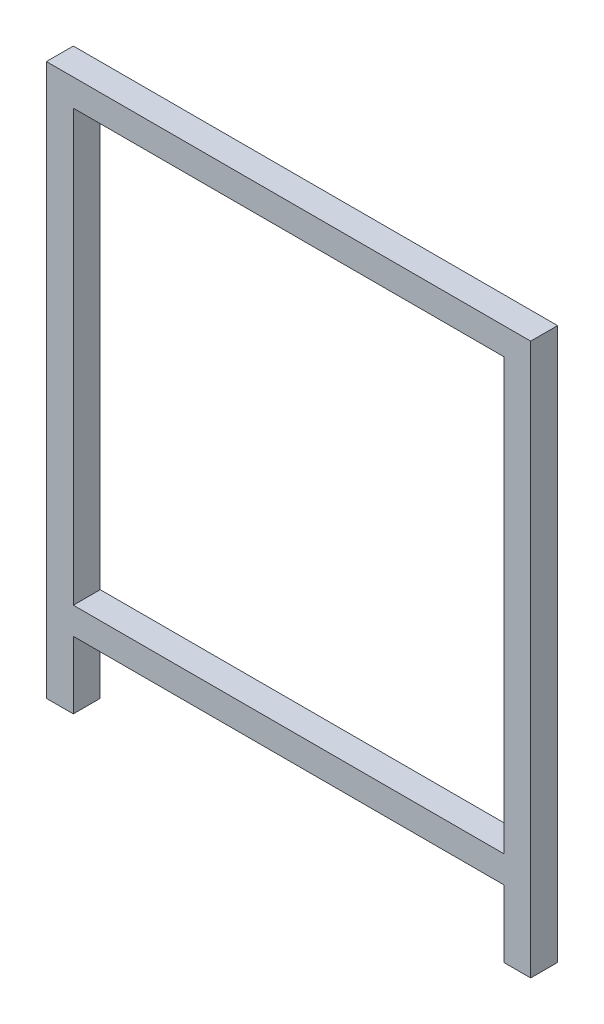
ISO-10303-21;
HEADER;
FILE_DESCRIPTION(('STEP AP214'),'2;1');
FILE_NAME('part.step','',(''),(''),'','','');
FILE_SCHEMA(('AUTOMOTIVE_DESIGN { 1 0 10303 214 1 1 1 1 }'));
ENDSEC;
DATA;
#1=APPLICATION_CONTEXT('core data for automotive mechanical design processes');
#2=APPLICATION_PROTOCOL_DEFINITION('international standard','automotive_design',2000,#1);
#3=PRODUCT_CONTEXT('',#1,'mechanical');
#4=PRODUCT('Part','Part','',(#3));
#5=PRODUCT_RELATED_PRODUCT_CATEGORY('part','',(#4));
#6=PRODUCT_DEFINITION_FORMATION('','',#4);
#7=PRODUCT_DEFINITION_CONTEXT('part definition',#1,'design');
#8=PRODUCT_DEFINITION('design','',#6,#7);
#9=PRODUCT_DEFINITION_SHAPE('','',#8);
#10=(LENGTH_UNIT() NAMED_UNIT(*) SI_UNIT(.MILLI.,.METRE.));
#11=(NAMED_UNIT(*) PLANE_ANGLE_UNIT() SI_UNIT($,.RADIAN.));
#12=(NAMED_UNIT(*) SI_UNIT($,.STERADIAN.) SOLID_ANGLE_UNIT());
#13=UNCERTAINTY_MEASURE_WITH_UNIT(LENGTH_MEASURE(1.E-05),#10,'distance_accuracy_value','');
#14=(GEOMETRIC_REPRESENTATION_CONTEXT(3) GLOBAL_UNCERTAINTY_ASSIGNED_CONTEXT((#13)) GLOBAL_UNIT_ASSIGNED_CONTEXT((#10,
#11,#12)) REPRESENTATION_CONTEXT('',''));
#15=CARTESIAN_POINT('',(0.,0.,0.));
#16=DIRECTION('',(0.,0.,1.));
#17=DIRECTION('',(1.,0.,0.));
#18=AXIS2_PLACEMENT_3D('',#15,#16,#17);
#19=CARTESIAN_POINT('',(-180.,180.,-10.));
#20=DIRECTION('',(-1.,0.,0.));
#21=DIRECTION('',(0.,-1.,0.));
#22=AXIS2_PLACEMENT_3D('',#19,#20,#21);
#23=PLANE('',#22);
#24=DIRECTION('',(0.,-1.,0.));
#25=VECTOR('',#24,1.);
#26=CARTESIAN_POINT('',(-180.,180.,10.));
#27=LINE('',#26,#25);
#28=CARTESIAN_POINT('',(-180.,180.,10.));
#29=VERTEX_POINT('',#28);
#30=CARTESIAN_POINT('',(-180.,-230.,10.));
#31=VERTEX_POINT('',#30);
#32=EDGE_CURVE('E154',#29,#31,#27,.T.);
#33=ORIENTED_EDGE('',*,*,#32,.F.);
#34=DIRECTION('',(0.,0.,1.));
#35=VECTOR('',#34,1.);
#36=CARTESIAN_POINT('',(-180.,180.,-10.));
#37=LINE('',#36,#35);
#38=CARTESIAN_POINT('',(-180.,180.,-10.));
#39=VERTEX_POINT('',#38);
#40=EDGE_CURVE('E11',#39,#29,#37,.T.);
#41=ORIENTED_EDGE('',*,*,#40,.F.);
#42=DIRECTION('',(0.,-1.,0.));
#43=VECTOR('',#42,1.);
#44=CARTESIAN_POINT('',(-180.,180.,-10.));
#45=LINE('',#44,#43);
#46=CARTESIAN_POINT('',(-180.,-230.,-10.));
#47=VERTEX_POINT('',#46);
#48=EDGE_CURVE('E158',#39,#47,#45,.T.);
#49=ORIENTED_EDGE('',*,*,#48,.T.);
#50=DIRECTION('',(0.,0.,1.));
#51=VECTOR('',#50,1.);
#52=CARTESIAN_POINT('',(-180.,-230.,-10.));
#53=LINE('',#52,#51);
#54=EDGE_CURVE('E35',#47,#31,#53,.T.);
#55=ORIENTED_EDGE('',*,*,#54,.T.);
#56=EDGE_LOOP('',(#33,#41,#49,#55));
#57=FACE_BOUND('',#56,.T.);
#58=ADVANCED_FACE('F32',(#57),#23,.T.);
#59=CARTESIAN_POINT('',(-180.,180.,-10.));
#60=DIRECTION('',(0.,1.,0.));
#61=DIRECTION('',(0.,0.,1.));
#62=AXIS2_PLACEMENT_3D('',#59,#60,#61);
#63=PLANE('',#62);
#64=DIRECTION('',(-1.,0.,0.));
#65=VECTOR('',#64,1.);
#66=CARTESIAN_POINT('',(-180.,180.,10.));
#67=LINE('',#66,#65);
#68=CARTESIAN_POINT('',(180.,180.,10.));
#69=VERTEX_POINT('',#68);
#70=EDGE_CURVE('E162',#69,#29,#67,.T.);
#71=ORIENTED_EDGE('',*,*,#70,.F.);
#72=DIRECTION('',(0.,0.,1.));
#73=VECTOR('',#72,1.);
#74=CARTESIAN_POINT('',(180.,180.,-10.));
#75=LINE('',#74,#73);
#76=CARTESIAN_POINT('',(180.,180.,-10.));
#77=VERTEX_POINT('',#76);
#78=EDGE_CURVE('E40',#77,#69,#75,.T.);
#79=ORIENTED_EDGE('',*,*,#78,.F.);
#80=DIRECTION('',(-1.,0.,0.));
#81=VECTOR('',#80,1.);
#82=CARTESIAN_POINT('',(-180.,180.,-10.));
#83=LINE('',#82,#81);
#84=EDGE_CURVE('E180',#77,#39,#83,.T.);
#85=ORIENTED_EDGE('',*,*,#84,.T.);
#86=ORIENTED_EDGE('',*,*,#40,.T.);
#87=EDGE_LOOP('',(#71,#79,#85,#86));
#88=FACE_BOUND('',#87,.T.);
#89=ADVANCED_FACE('F227',(#88),#63,.T.);
#90=CARTESIAN_POINT('',(180.,180.,-10.));
#91=DIRECTION('',(1.,0.,0.));
#92=DIRECTION('',(0.,1.,0.));
#93=AXIS2_PLACEMENT_3D('',#90,#91,#92);
#94=PLANE('',#93);
#95=DIRECTION('',(0.,1.,0.));
#96=VECTOR('',#95,1.);
#97=CARTESIAN_POINT('',(180.,180.,10.));
#98=LINE('',#97,#96);
#99=CARTESIAN_POINT('',(180.,-230.,10.));
#100=VERTEX_POINT('',#99);
#101=EDGE_CURVE('E200',#100,#69,#98,.T.);
#102=ORIENTED_EDGE('',*,*,#101,.F.);
#103=DIRECTION('',(0.,0.,1.));
#104=VECTOR('',#103,1.);
#105=CARTESIAN_POINT('',(180.,-230.,-10.));
#106=LINE('',#105,#104);
#107=CARTESIAN_POINT('',(180.,-230.,-10.));
#108=VERTEX_POINT('',#107);
#109=EDGE_CURVE('E206',#108,#100,#106,.T.);
#110=ORIENTED_EDGE('',*,*,#109,.F.);
#111=DIRECTION('',(0.,1.,0.));
#112=VECTOR('',#111,1.);
#113=CARTESIAN_POINT('',(180.,180.,-10.));
#114=LINE('',#113,#112);
#115=EDGE_CURVE('E177',#108,#77,#114,.T.);
#116=ORIENTED_EDGE('',*,*,#115,.T.);
#117=ORIENTED_EDGE('',*,*,#78,.T.);
#118=EDGE_LOOP('',(#102,#110,#116,#117));
#119=FACE_BOUND('',#118,.T.);
#120=ADVANCED_FACE('F246',(#119),#94,.T.);
#121=CARTESIAN_POINT('',(160.,-230.,-10.));
#122=DIRECTION('',(0.,-1.,0.));
#123=DIRECTION('',(1.,0.,0.));
#124=AXIS2_PLACEMENT_3D('',#121,#122,#123);
#125=PLANE('',#124);
#126=DIRECTION('',(1.,0.,0.));
#127=VECTOR('',#126,1.);
#128=CARTESIAN_POINT('',(160.,-230.,10.));
#129=LINE('',#128,#127);
#130=CARTESIAN_POINT('',(160.,-230.,10.));
#131=VERTEX_POINT('',#130);
#132=EDGE_CURVE('E197',#131,#100,#129,.T.);
#133=ORIENTED_EDGE('',*,*,#132,.F.);
#134=DIRECTION('',(0.,0.,1.));
#135=VECTOR('',#134,1.);
#136=CARTESIAN_POINT('',(160.,-230.,-10.));
#137=LINE('',#136,#135);
#138=CARTESIAN_POINT('',(160.,-230.,-10.));
#139=VERTEX_POINT('',#138);
#140=EDGE_CURVE('E208',#139,#131,#137,.T.);
#141=ORIENTED_EDGE('',*,*,#140,.F.);
#142=DIRECTION('',(1.,0.,0.));
#143=VECTOR('',#142,1.);
#144=CARTESIAN_POINT('',(160.,-230.,-10.));
#145=LINE('',#144,#143);
#146=EDGE_CURVE('E174',#139,#108,#145,.T.);
#147=ORIENTED_EDGE('',*,*,#146,.T.);
#148=ORIENTED_EDGE('',*,*,#109,.T.);
#149=EDGE_LOOP('',(#133,#141,#147,#148));
#150=FACE_BOUND('',#149,.T.);
#151=ADVANCED_FACE('F244',(#150),#125,.T.);
#152=CARTESIAN_POINT('',(160.,-230.,-10.));
#153=DIRECTION('',(-1.,0.,0.));
#154=DIRECTION('',(0.,0.,1.));
#155=AXIS2_PLACEMENT_3D('',#152,#153,#154);
#156=PLANE('',#155);
#157=DIRECTION('',(0.,-1.,0.));
#158=VECTOR('',#157,1.);
#159=CARTESIAN_POINT('',(160.,-230.,10.));
#160=LINE('',#159,#158);
#161=CARTESIAN_POINT('',(160.,-180.,10.));
#162=VERTEX_POINT('',#161);
#163=EDGE_CURVE('E194',#162,#131,#160,.T.);
#164=ORIENTED_EDGE('',*,*,#163,.F.);
#165=DIRECTION('',(0.,0.,1.));
#166=VECTOR('',#165,1.);
#167=CARTESIAN_POINT('',(160.,-180.,-10.));
#168=LINE('',#167,#166);
#169=CARTESIAN_POINT('',(160.,-180.,-10.));
#170=VERTEX_POINT('',#169);
#171=EDGE_CURVE('E210',#170,#162,#168,.T.);
#172=ORIENTED_EDGE('',*,*,#171,.F.);
#173=DIRECTION('',(0.,-1.,0.));
#174=VECTOR('',#173,1.);
#175=CARTESIAN_POINT('',(160.,-230.,-10.));
#176=LINE('',#175,#174);
#177=EDGE_CURVE('E171',#170,#139,#176,.T.);
#178=ORIENTED_EDGE('',*,*,#177,.T.);
#179=ORIENTED_EDGE('',*,*,#140,.T.);
#180=EDGE_LOOP('',(#164,#172,#178,#179));
#181=FACE_BOUND('',#180,.T.);
#182=ADVANCED_FACE('F240',(#181),#156,.T.);
#183=CARTESIAN_POINT('',(160.,-180.,-10.));
#184=DIRECTION('',(0.,-1.,0.));
#185=DIRECTION('',(1.,0.,0.));
#186=AXIS2_PLACEMENT_3D('',#183,#184,#185);
#187=PLANE('',#186);
#188=DIRECTION('',(1.,0.,0.));
#189=VECTOR('',#188,1.);
#190=CARTESIAN_POINT('',(160.,-180.,10.));
#191=LINE('',#190,#189);
#192=CARTESIAN_POINT('',(-160.,-180.,10.));
#193=VERTEX_POINT('',#192);
#194=EDGE_CURVE('E191',#193,#162,#191,.T.);
#195=ORIENTED_EDGE('',*,*,#194,.F.);
#196=DIRECTION('',(0.,0.,1.));
#197=VECTOR('',#196,1.);
#198=CARTESIAN_POINT('',(-160.,-180.,-10.));
#199=LINE('',#198,#197);
#200=CARTESIAN_POINT('',(-160.,-180.,-10.));
#201=VERTEX_POINT('',#200);
#202=EDGE_CURVE('E212',#201,#193,#199,.T.);
#203=ORIENTED_EDGE('',*,*,#202,.F.);
#204=DIRECTION('',(1.,0.,0.));
#205=VECTOR('',#204,1.);
#206=CARTESIAN_POINT('',(160.,-180.,-10.));
#207=LINE('',#206,#205);
#208=EDGE_CURVE('E168',#201,#170,#207,.T.);
#209=ORIENTED_EDGE('',*,*,#208,.T.);
#210=ORIENTED_EDGE('',*,*,#171,.T.);
#211=EDGE_LOOP('',(#195,#203,#209,#210));
#212=FACE_BOUND('',#211,.T.);
#213=ADVANCED_FACE('F238',(#212),#187,.T.);
#214=CARTESIAN_POINT('',(-160.,-180.,-10.));
#215=DIRECTION('',(1.,0.,0.));
#216=DIRECTION('',(0.,0.,-1.));
#217=AXIS2_PLACEMENT_3D('',#214,#215,#216);
#218=PLANE('',#217);
#219=DIRECTION('',(0.,1.,0.));
#220=VECTOR('',#219,1.);
#221=CARTESIAN_POINT('',(-160.,-180.,10.));
#222=LINE('',#221,#220);
#223=CARTESIAN_POINT('',(-160.,-230.,10.));
#224=VERTEX_POINT('',#223);
#225=EDGE_CURVE('E188',#224,#193,#222,.T.);
#226=ORIENTED_EDGE('',*,*,#225,.F.);
#227=DIRECTION('',(0.,0.,1.));
#228=VECTOR('',#227,1.);
#229=CARTESIAN_POINT('',(-160.,-230.,-10.));
#230=LINE('',#229,#228);
#231=CARTESIAN_POINT('',(-160.,-230.,-10.));
#232=VERTEX_POINT('',#231);
#233=EDGE_CURVE('E213',#232,#224,#230,.T.);
#234=ORIENTED_EDGE('',*,*,#233,.F.);
#235=DIRECTION('',(0.,1.,0.));
#236=VECTOR('',#235,1.);
#237=CARTESIAN_POINT('',(-160.,-180.,-10.));
#238=LINE('',#237,#236);
#239=EDGE_CURVE('E165',#232,#201,#238,.T.);
#240=ORIENTED_EDGE('',*,*,#239,.T.);
#241=ORIENTED_EDGE('',*,*,#202,.T.);
#242=EDGE_LOOP('',(#226,#234,#240,#241));
#243=FACE_BOUND('',#242,.T.);
#244=ADVANCED_FACE('F234',(#243),#218,.T.);
#245=CARTESIAN_POINT('',(-180.,-230.,-10.));
#246=DIRECTION('',(0.,-1.,0.));
#247=DIRECTION('',(0.,0.,-1.));
#248=AXIS2_PLACEMENT_3D('',#245,#246,#247);
#249=PLANE('',#248);
#250=DIRECTION('',(1.,0.,0.));
#251=VECTOR('',#250,1.);
#252=CARTESIAN_POINT('',(-180.,-230.,10.));
#253=LINE('',#252,#251);
#254=EDGE_CURVE('E185',#31,#224,#253,.T.);
#255=ORIENTED_EDGE('',*,*,#254,.F.);
#256=ORIENTED_EDGE('',*,*,#54,.F.);
#257=DIRECTION('',(1.,0.,0.));
#258=VECTOR('',#257,1.);
#259=CARTESIAN_POINT('',(-180.,-230.,-10.));
#260=LINE('',#259,#258);
#261=EDGE_CURVE('E161',#47,#232,#260,.T.);
#262=ORIENTED_EDGE('',*,*,#261,.T.);
#263=ORIENTED_EDGE('',*,*,#233,.T.);
#264=EDGE_LOOP('',(#255,#256,#262,#263));
#265=FACE_BOUND('',#264,.T.);
#266=ADVANCED_FACE('F221',(#265),#249,.T.);
#267=CARTESIAN_POINT('',(0.,0.,-10.));
#268=DIRECTION('',(0.,0.,1.));
#269=DIRECTION('',(1.,0.,0.));
#270=AXIS2_PLACEMENT_3D('',#267,#268,#269);
#271=PLANE('',#270);
#272=DIRECTION('',(-1.,0.,0.));
#273=VECTOR('',#272,1.);
#274=CARTESIAN_POINT('',(-160.,160.,-10.));
#275=LINE('',#274,#273);
#276=CARTESIAN_POINT('',(160.,160.,-10.));
#277=VERTEX_POINT('',#276);
#278=CARTESIAN_POINT('',(-160.,160.,-10.));
#279=VERTEX_POINT('',#278);
#280=EDGE_CURVE('E129',#277,#279,#275,.T.);
#281=ORIENTED_EDGE('',*,*,#280,.T.);
#282=DIRECTION('',(0.,-1.,0.));
#283=VECTOR('',#282,1.);
#284=CARTESIAN_POINT('',(-160.,160.,-10.));
#285=LINE('',#284,#283);
#286=CARTESIAN_POINT('',(-160.,-160.,-10.));
#287=VERTEX_POINT('',#286);
#288=EDGE_CURVE('E123',#279,#287,#285,.T.);
#289=ORIENTED_EDGE('',*,*,#288,.T.);
#290=DIRECTION('',(1.,0.,0.));
#291=VECTOR('',#290,1.);
#292=CARTESIAN_POINT('',(-160.,-160.,-10.));
#293=LINE('',#292,#291);
#294=CARTESIAN_POINT('',(160.,-160.,-10.));
#295=VERTEX_POINT('',#294);
#296=EDGE_CURVE('E132',#287,#295,#293,.T.);
#297=ORIENTED_EDGE('',*,*,#296,.T.);
#298=DIRECTION('',(0.,1.,0.));
#299=VECTOR('',#298,1.);
#300=CARTESIAN_POINT('',(160.,160.,-10.));
#301=LINE('',#300,#299);
#302=EDGE_CURVE('E48',#295,#277,#301,.T.);
#303=ORIENTED_EDGE('',*,*,#302,.T.);
#304=EDGE_LOOP('',(#281,#289,#297,#303));
#305=FACE_BOUND('',#304,.T.);
#306=ORIENTED_EDGE('',*,*,#48,.F.);
#307=ORIENTED_EDGE('',*,*,#84,.F.);
#308=ORIENTED_EDGE('',*,*,#115,.F.);
#309=ORIENTED_EDGE('',*,*,#146,.F.);
#310=ORIENTED_EDGE('',*,*,#177,.F.);
#311=ORIENTED_EDGE('',*,*,#208,.F.);
#312=ORIENTED_EDGE('',*,*,#239,.F.);
#313=ORIENTED_EDGE('',*,*,#261,.F.);
#314=EDGE_LOOP('',(#306,#307,#308,#309,#310,#311,#312,#313));
#315=FACE_BOUND('',#314,.T.);
#316=ADVANCED_FACE('F136',(#305,#315),#271,.F.);
#317=CARTESIAN_POINT('',(0.,0.,10.));
#318=DIRECTION('',(0.,0.,1.));
#319=DIRECTION('',(1.,0.,0.));
#320=AXIS2_PLACEMENT_3D('',#317,#318,#319);
#321=PLANE('',#320);
#322=DIRECTION('',(0.,-1.,0.));
#323=VECTOR('',#322,1.);
#324=CARTESIAN_POINT('',(-160.,160.,10.));
#325=LINE('',#324,#323);
#326=CARTESIAN_POINT('',(-160.,160.,10.));
#327=VERTEX_POINT('',#326);
#328=CARTESIAN_POINT('',(-160.,-160.,10.));
#329=VERTEX_POINT('',#328);
#330=EDGE_CURVE('E56',#327,#329,#325,.T.);
#331=ORIENTED_EDGE('',*,*,#330,.F.);
#332=DIRECTION('',(-1.,0.,0.));
#333=VECTOR('',#332,1.);
#334=CARTESIAN_POINT('',(-160.,160.,10.));
#335=LINE('',#334,#333);
#336=CARTESIAN_POINT('',(160.,160.,10.));
#337=VERTEX_POINT('',#336);
#338=EDGE_CURVE('E139',#337,#327,#335,.T.);
#339=ORIENTED_EDGE('',*,*,#338,.F.);
#340=DIRECTION('',(0.,1.,0.));
#341=VECTOR('',#340,1.);
#342=CARTESIAN_POINT('',(160.,160.,10.));
#343=LINE('',#342,#341);
#344=CARTESIAN_POINT('',(160.,-160.,10.));
#345=VERTEX_POINT('',#344);
#346=EDGE_CURVE('E142',#345,#337,#343,.T.);
#347=ORIENTED_EDGE('',*,*,#346,.F.);
#348=DIRECTION('',(1.,0.,0.));
#349=VECTOR('',#348,1.);
#350=CARTESIAN_POINT('',(-160.,-160.,10.));
#351=LINE('',#350,#349);
#352=EDGE_CURVE('E148',#329,#345,#351,.T.);
#353=ORIENTED_EDGE('',*,*,#352,.F.);
#354=EDGE_LOOP('',(#331,#339,#347,#353));
#355=FACE_BOUND('',#354,.T.);
#356=ORIENTED_EDGE('',*,*,#32,.T.);
#357=ORIENTED_EDGE('',*,*,#254,.T.);
#358=ORIENTED_EDGE('',*,*,#225,.T.);
#359=ORIENTED_EDGE('',*,*,#194,.T.);
#360=ORIENTED_EDGE('',*,*,#163,.T.);
#361=ORIENTED_EDGE('',*,*,#132,.T.);
#362=ORIENTED_EDGE('',*,*,#101,.T.);
#363=ORIENTED_EDGE('',*,*,#70,.T.);
#364=EDGE_LOOP('',(#356,#357,#358,#359,#360,#361,#362,#363));
#365=FACE_BOUND('',#364,.T.);
#366=ADVANCED_FACE('F223',(#355,#365),#321,.T.);
#367=CARTESIAN_POINT('',(-160.,160.,-10.));
#368=DIRECTION('',(-1.,0.,0.));
#369=DIRECTION('',(0.,-1.,0.));
#370=AXIS2_PLACEMENT_3D('',#367,#368,#369);
#371=PLANE('',#370);
#372=ORIENTED_EDGE('',*,*,#330,.T.);
#373=DIRECTION('',(0.,0.,1.));
#374=VECTOR('',#373,1.);
#375=CARTESIAN_POINT('',(-160.,-160.,-10.));
#376=LINE('',#375,#374);
#377=EDGE_CURVE('E119',#287,#329,#376,.T.);
#378=ORIENTED_EDGE('',*,*,#377,.F.);
#379=ORIENTED_EDGE('',*,*,#288,.F.);
#380=DIRECTION('',(0.,0.,1.));
#381=VECTOR('',#380,1.);
#382=CARTESIAN_POINT('',(-160.,160.,-10.));
#383=LINE('',#382,#381);
#384=EDGE_CURVE('E152',#279,#327,#383,.T.);
#385=ORIENTED_EDGE('',*,*,#384,.T.);
#386=EDGE_LOOP('',(#372,#378,#379,#385));
#387=FACE_BOUND('',#386,.T.);
#388=ADVANCED_FACE('F121',(#387),#371,.F.);
#389=CARTESIAN_POINT('',(-160.,160.,-10.));
#390=DIRECTION('',(0.,1.,0.));
#391=DIRECTION('',(-1.,0.,0.));
#392=AXIS2_PLACEMENT_3D('',#389,#390,#391);
#393=PLANE('',#392);
#394=ORIENTED_EDGE('',*,*,#338,.T.);
#395=ORIENTED_EDGE('',*,*,#384,.F.);
#396=ORIENTED_EDGE('',*,*,#280,.F.);
#397=DIRECTION('',(0.,0.,1.));
#398=VECTOR('',#397,1.);
#399=CARTESIAN_POINT('',(160.,160.,-10.));
#400=LINE('',#399,#398);
#401=EDGE_CURVE('E155',#277,#337,#400,.T.);
#402=ORIENTED_EDGE('',*,*,#401,.T.);
#403=EDGE_LOOP('',(#394,#395,#396,#402));
#404=FACE_BOUND('',#403,.T.);
#405=ADVANCED_FACE('F329',(#404),#393,.F.);
#406=CARTESIAN_POINT('',(160.,160.,-10.));
#407=DIRECTION('',(1.,0.,0.));
#408=DIRECTION('',(0.,0.,-1.));
#409=AXIS2_PLACEMENT_3D('',#406,#407,#408);
#410=PLANE('',#409);
#411=ORIENTED_EDGE('',*,*,#346,.T.);
#412=ORIENTED_EDGE('',*,*,#401,.F.);
#413=ORIENTED_EDGE('',*,*,#302,.F.);
#414=DIRECTION('',(0.,0.,1.));
#415=VECTOR('',#414,1.);
#416=CARTESIAN_POINT('',(160.,-160.,-10.));
#417=LINE('',#416,#415);
#418=EDGE_CURVE('E128',#295,#345,#417,.T.);
#419=ORIENTED_EDGE('',*,*,#418,.T.);
#420=EDGE_LOOP('',(#411,#412,#413,#419));
#421=FACE_BOUND('',#420,.T.);
#422=ADVANCED_FACE('F338',(#421),#410,.F.);
#423=CARTESIAN_POINT('',(-160.,-160.,-10.));
#424=DIRECTION('',(0.,-1.,0.));
#425=DIRECTION('',(1.,0.,0.));
#426=AXIS2_PLACEMENT_3D('',#423,#424,#425);
#427=PLANE('',#426);
#428=ORIENTED_EDGE('',*,*,#352,.T.);
#429=ORIENTED_EDGE('',*,*,#418,.F.);
#430=ORIENTED_EDGE('',*,*,#296,.F.);
#431=ORIENTED_EDGE('',*,*,#377,.T.);
#432=EDGE_LOOP('',(#428,#429,#430,#431));
#433=FACE_BOUND('',#432,.T.);
#434=ADVANCED_FACE('F133',(#433),#427,.F.);
#435=CLOSED_SHELL('',(#58,#89,#120,#151,#182,#213,#244,#266,#316,#366,#388,#405,#422,#434));
#436=MANIFOLD_SOLID_BREP('B2',#435);
#437=ADVANCED_BREP_SHAPE_REPRESENTATION('',(#18,#436),#14);
#438=SHAPE_DEFINITION_REPRESENTATION(#9,#437);
ENDSEC;
END-ISO-10303-21;
